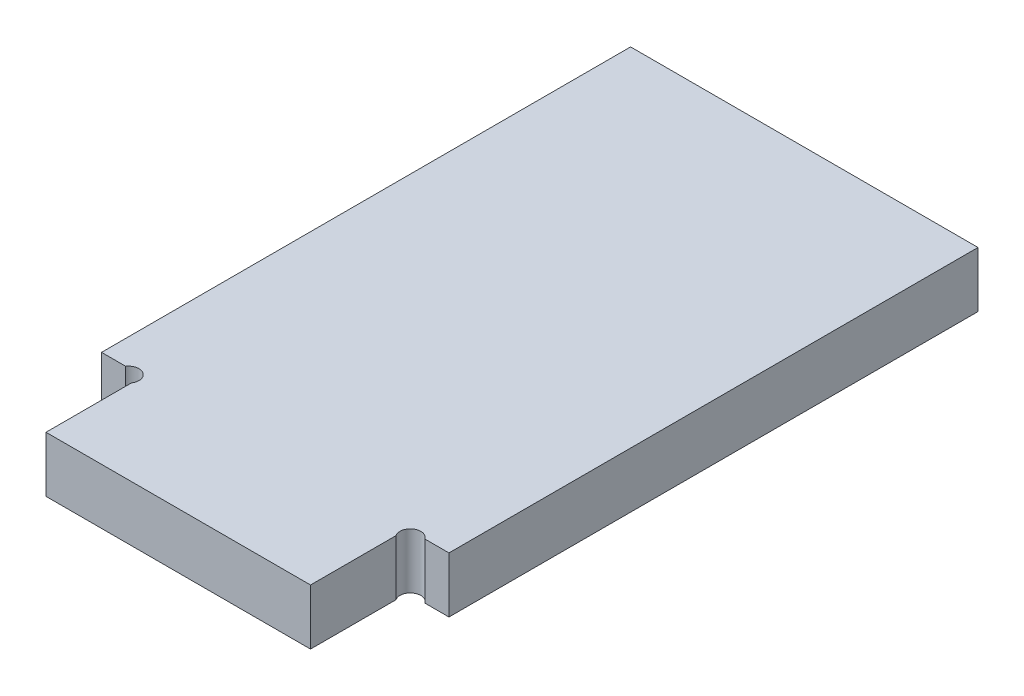
ISO-10303-21;
HEADER;
FILE_DESCRIPTION(('STEP AP214'),'2;1');
FILE_NAME('part.step','',(''),(''),'','','');
FILE_SCHEMA(('AUTOMOTIVE_DESIGN { 1 0 10303 214 1 1 1 1 }'));
ENDSEC;
DATA;
#1=APPLICATION_CONTEXT('core data for automotive mechanical design processes');
#2=APPLICATION_PROTOCOL_DEFINITION('international standard','automotive_design',2000,#1);
#3=PRODUCT_CONTEXT('',#1,'mechanical');
#4=PRODUCT('Part','Part','',(#3));
#5=PRODUCT_RELATED_PRODUCT_CATEGORY('part','',(#4));
#6=PRODUCT_DEFINITION_FORMATION('','',#4);
#7=PRODUCT_DEFINITION_CONTEXT('part definition',#1,'design');
#8=PRODUCT_DEFINITION('design','',#6,#7);
#9=PRODUCT_DEFINITION_SHAPE('','',#8);
#10=(LENGTH_UNIT() NAMED_UNIT(*) SI_UNIT(.MILLI.,.METRE.));
#11=(NAMED_UNIT(*) PLANE_ANGLE_UNIT() SI_UNIT($,.RADIAN.));
#12=(NAMED_UNIT(*) SI_UNIT($,.STERADIAN.) SOLID_ANGLE_UNIT());
#13=UNCERTAINTY_MEASURE_WITH_UNIT(LENGTH_MEASURE(1.E-05),#10,'distance_accuracy_value','');
#14=(GEOMETRIC_REPRESENTATION_CONTEXT(3) GLOBAL_UNCERTAINTY_ASSIGNED_CONTEXT((#13)) GLOBAL_UNIT_ASSIGNED_CONTEXT((#10,
#11,#12)) REPRESENTATION_CONTEXT('',''));
#15=CARTESIAN_POINT('',(0.,0.,0.));
#16=DIRECTION('',(0.,0.,1.));
#17=DIRECTION('',(1.,0.,0.));
#18=AXIS2_PLACEMENT_3D('',#15,#16,#17);
#19=CARTESIAN_POINT('',(-2.0296,0.4,0.083515507542013));
#20=DIRECTION('',(0.,-1.,0.));
#21=DIRECTION('',(0.,0.,-1.));
#22=AXIS2_PLACEMENT_3D('',#19,#20,#21);
#23=CYLINDRICAL_SURFACE('',#22,0.15);
#24=CARTESIAN_POINT('',(-2.0296,-0.4,0.083515507542013));
#25=DIRECTION('',(0.,-1.,0.));
#26=DIRECTION('',(0.,0.,1.));
#27=AXIS2_PLACEMENT_3D('',#24,#25,#26);
#28=CIRCLE('',#27,0.15);
#29=CARTESIAN_POINT('',(-2.1542,-0.4,0.));
#30=VERTEX_POINT('',#29);
#31=CARTESIAN_POINT('',(-1.905,-0.4,0.167031015084026));
#32=VERTEX_POINT('',#31);
#33=EDGE_CURVE('E141',#30,#32,#28,.T.);
#34=ORIENTED_EDGE('',*,*,#33,.T.);
#35=DIRECTION('',(0.,-1.,0.));
#36=VECTOR('',#35,1.);
#37=CARTESIAN_POINT('',(-1.905,0.4,0.167031015084026));
#38=LINE('',#37,#36);
#39=CARTESIAN_POINT('',(-1.905,0.4,0.167031015084026));
#40=VERTEX_POINT('',#39);
#41=EDGE_CURVE('E11',#40,#32,#38,.T.);
#42=ORIENTED_EDGE('',*,*,#41,.F.);
#43=CARTESIAN_POINT('',(-2.0296,0.4,0.083515507542013));
#44=DIRECTION('',(0.,-1.,0.));
#45=DIRECTION('',(0.,0.,1.));
#46=AXIS2_PLACEMENT_3D('',#43,#44,#45);
#47=CIRCLE('',#46,0.15);
#48=CARTESIAN_POINT('',(-2.1542,0.4,0.));
#49=VERTEX_POINT('',#48);
#50=EDGE_CURVE('E159',#49,#40,#47,.T.);
#51=ORIENTED_EDGE('',*,*,#50,.F.);
#52=DIRECTION('',(0.,-1.,0.));
#53=VECTOR('',#52,1.);
#54=CARTESIAN_POINT('',(-2.1542,0.4,0.));
#55=LINE('',#54,#53);
#56=EDGE_CURVE('E137',#49,#30,#55,.T.);
#57=ORIENTED_EDGE('',*,*,#56,.T.);
#58=EDGE_LOOP('',(#34,#42,#51,#57));
#59=FACE_BOUND('',#58,.T.);
#60=ADVANCED_FACE('F33',(#59),#23,.F.);
#61=CARTESIAN_POINT('',(-1.905,0.4,0.167031015084026));
#62=DIRECTION('',(1.,0.,0.));
#63=DIRECTION('',(0.,0.,-1.));
#64=AXIS2_PLACEMENT_3D('',#61,#62,#63);
#65=PLANE('',#64);
#66=DIRECTION('',(0.,0.,1.));
#67=VECTOR('',#66,1.);
#68=CARTESIAN_POINT('',(-1.905,-0.4,0.167031015084026));
#69=LINE('',#68,#67);
#70=CARTESIAN_POINT('',(-1.905,-0.4,1.397));
#71=VERTEX_POINT('',#70);
#72=EDGE_CURVE('E144',#32,#71,#69,.T.);
#73=ORIENTED_EDGE('',*,*,#72,.T.);
#74=DIRECTION('',(0.,-1.,0.));
#75=VECTOR('',#74,1.);
#76=CARTESIAN_POINT('',(-1.905,0.4,1.397));
#77=LINE('',#76,#75);
#78=CARTESIAN_POINT('',(-1.905,0.4,1.397));
#79=VERTEX_POINT('',#78);
#80=EDGE_CURVE('E41',#79,#71,#77,.T.);
#81=ORIENTED_EDGE('',*,*,#80,.F.);
#82=DIRECTION('',(0.,0.,1.));
#83=VECTOR('',#82,1.);
#84=CARTESIAN_POINT('',(-1.905,0.4,0.167031015084026));
#85=LINE('',#84,#83);
#86=EDGE_CURVE('E98',#40,#79,#85,.T.);
#87=ORIENTED_EDGE('',*,*,#86,.F.);
#88=ORIENTED_EDGE('',*,*,#41,.T.);
#89=EDGE_LOOP('',(#73,#81,#87,#88));
#90=FACE_BOUND('',#89,.T.);
#91=ADVANCED_FACE('F208',(#90),#65,.F.);
#92=CARTESIAN_POINT('',(-1.905,0.4,1.397));
#93=DIRECTION('',(0.,0.,-1.));
#94=DIRECTION('',(-1.,0.,0.));
#95=AXIS2_PLACEMENT_3D('',#92,#93,#94);
#96=PLANE('',#95);
#97=DIRECTION('',(1.,0.,0.));
#98=VECTOR('',#97,1.);
#99=CARTESIAN_POINT('',(-1.905,-0.4,1.397));
#100=LINE('',#99,#98);
#101=CARTESIAN_POINT('',(1.905,-0.4,1.397));
#102=VERTEX_POINT('',#101);
#103=EDGE_CURVE('E146',#71,#102,#100,.T.);
#104=ORIENTED_EDGE('',*,*,#103,.T.);
#105=DIRECTION('',(0.,-1.,0.));
#106=VECTOR('',#105,1.);
#107=CARTESIAN_POINT('',(1.905,0.4,1.397));
#108=LINE('',#107,#106);
#109=CARTESIAN_POINT('',(1.905,0.4,1.397));
#110=VERTEX_POINT('',#109);
#111=EDGE_CURVE('E172',#110,#102,#108,.T.);
#112=ORIENTED_EDGE('',*,*,#111,.F.);
#113=DIRECTION('',(1.,0.,0.));
#114=VECTOR('',#113,1.);
#115=CARTESIAN_POINT('',(-1.905,0.4,1.397));
#116=LINE('',#115,#114);
#117=EDGE_CURVE('E180',#79,#110,#116,.T.);
#118=ORIENTED_EDGE('',*,*,#117,.F.);
#119=ORIENTED_EDGE('',*,*,#80,.T.);
#120=EDGE_LOOP('',(#104,#112,#118,#119));
#121=FACE_BOUND('',#120,.T.);
#122=ADVANCED_FACE('F178',(#121),#96,.F.);
#123=CARTESIAN_POINT('',(1.905,0.4,0.167031015084026));
#124=DIRECTION('',(-1.,0.,0.));
#125=DIRECTION('',(0.,0.,1.));
#126=AXIS2_PLACEMENT_3D('',#123,#124,#125);
#127=PLANE('',#126);
#128=DIRECTION('',(0.,0.,-1.));
#129=VECTOR('',#128,1.);
#130=CARTESIAN_POINT('',(1.905,-0.4,0.167031015084026));
#131=LINE('',#130,#129);
#132=CARTESIAN_POINT('',(1.905,-0.4,0.167031015084026));
#133=VERTEX_POINT('',#132);
#134=EDGE_CURVE('E148',#102,#133,#131,.T.);
#135=ORIENTED_EDGE('',*,*,#134,.T.);
#136=DIRECTION('',(0.,-1.,0.));
#137=VECTOR('',#136,1.);
#138=CARTESIAN_POINT('',(1.905,0.4,0.167031015084026));
#139=LINE('',#138,#137);
#140=CARTESIAN_POINT('',(1.905,0.4,0.167031015084026));
#141=VERTEX_POINT('',#140);
#142=EDGE_CURVE('E169',#141,#133,#139,.T.);
#143=ORIENTED_EDGE('',*,*,#142,.F.);
#144=DIRECTION('',(0.,0.,-1.));
#145=VECTOR('',#144,1.);
#146=CARTESIAN_POINT('',(1.905,0.4,0.167031015084026));
#147=LINE('',#146,#145);
#148=EDGE_CURVE('E198',#110,#141,#147,.T.);
#149=ORIENTED_EDGE('',*,*,#148,.F.);
#150=ORIENTED_EDGE('',*,*,#111,.T.);
#151=EDGE_LOOP('',(#135,#143,#149,#150));
#152=FACE_BOUND('',#151,.T.);
#153=ADVANCED_FACE('F189',(#152),#127,.F.);
#154=CARTESIAN_POINT('',(2.0296,0.4,0.0835155075420125));
#155=DIRECTION('',(0.,-1.,0.));
#156=DIRECTION('',(0.,0.,-1.));
#157=AXIS2_PLACEMENT_3D('',#154,#155,#156);
#158=CYLINDRICAL_SURFACE('',#157,0.15);
#159=CARTESIAN_POINT('',(2.0296,-0.4,0.0835155075420125));
#160=DIRECTION('',(0.,-1.,0.));
#161=DIRECTION('',(0.,0.,-1.));
#162=AXIS2_PLACEMENT_3D('',#159,#160,#161);
#163=CIRCLE('',#162,0.15);
#164=CARTESIAN_POINT('',(2.1542,-0.4,0.));
#165=VERTEX_POINT('',#164);
#166=EDGE_CURVE('E150',#133,#165,#163,.T.);
#167=ORIENTED_EDGE('',*,*,#166,.T.);
#168=DIRECTION('',(0.,-1.,0.));
#169=VECTOR('',#168,1.);
#170=CARTESIAN_POINT('',(2.1542,0.4,0.));
#171=LINE('',#170,#169);
#172=CARTESIAN_POINT('',(2.1542,0.4,0.));
#173=VERTEX_POINT('',#172);
#174=EDGE_CURVE('E166',#173,#165,#171,.T.);
#175=ORIENTED_EDGE('',*,*,#174,.F.);
#176=CARTESIAN_POINT('',(2.0296,0.4,0.0835155075420125));
#177=DIRECTION('',(0.,-1.,0.));
#178=DIRECTION('',(0.,0.,-1.));
#179=AXIS2_PLACEMENT_3D('',#176,#177,#178);
#180=CIRCLE('',#179,0.15);
#181=EDGE_CURVE('E195',#141,#173,#180,.T.);
#182=ORIENTED_EDGE('',*,*,#181,.F.);
#183=ORIENTED_EDGE('',*,*,#142,.T.);
#184=EDGE_LOOP('',(#167,#175,#182,#183));
#185=FACE_BOUND('',#184,.T.);
#186=ADVANCED_FACE('F193',(#185),#158,.F.);
#187=CARTESIAN_POINT('',(2.1542,0.4,0.));
#188=DIRECTION('',(0.,0.,-1.));
#189=DIRECTION('',(-1.,0.,0.));
#190=AXIS2_PLACEMENT_3D('',#187,#188,#189);
#191=PLANE('',#190);
#192=DIRECTION('',(1.,0.,0.));
#193=VECTOR('',#192,1.);
#194=CARTESIAN_POINT('',(2.1542,-0.4,0.));
#195=LINE('',#194,#193);
#196=CARTESIAN_POINT('',(2.5019,-0.4,0.));
#197=VERTEX_POINT('',#196);
#198=EDGE_CURVE('E152',#165,#197,#195,.T.);
#199=ORIENTED_EDGE('',*,*,#198,.T.);
#200=DIRECTION('',(0.,-1.,0.));
#201=VECTOR('',#200,1.);
#202=CARTESIAN_POINT('',(2.5019,0.4,0.));
#203=LINE('',#202,#201);
#204=CARTESIAN_POINT('',(2.5019,0.4,0.));
#205=VERTEX_POINT('',#204);
#206=EDGE_CURVE('E163',#205,#197,#203,.T.);
#207=ORIENTED_EDGE('',*,*,#206,.F.);
#208=DIRECTION('',(1.,0.,0.));
#209=VECTOR('',#208,1.);
#210=CARTESIAN_POINT('',(2.1542,0.4,0.));
#211=LINE('',#210,#209);
#212=EDGE_CURVE('E197',#173,#205,#211,.T.);
#213=ORIENTED_EDGE('',*,*,#212,.F.);
#214=ORIENTED_EDGE('',*,*,#174,.T.);
#215=EDGE_LOOP('',(#199,#207,#213,#214));
#216=FACE_BOUND('',#215,.T.);
#217=ADVANCED_FACE('F220',(#216),#191,.F.);
#218=CARTESIAN_POINT('',(2.5019,0.4,0.));
#219=DIRECTION('',(-1.,0.,0.));
#220=DIRECTION('',(0.,0.,1.));
#221=AXIS2_PLACEMENT_3D('',#218,#219,#220);
#222=PLANE('',#221);
#223=DIRECTION('',(0.,0.,-1.));
#224=VECTOR('',#223,1.);
#225=CARTESIAN_POINT('',(2.5019,-0.4,0.));
#226=LINE('',#225,#224);
#227=CARTESIAN_POINT('',(2.5019,-0.4,-7.62));
#228=VERTEX_POINT('',#227);
#229=EDGE_CURVE('E154',#197,#228,#226,.T.);
#230=ORIENTED_EDGE('',*,*,#229,.T.);
#231=DIRECTION('',(0.,-1.,0.));
#232=VECTOR('',#231,1.);
#233=CARTESIAN_POINT('',(2.5019,0.4,-7.62));
#234=LINE('',#233,#232);
#235=CARTESIAN_POINT('',(2.5019,0.4,-7.62));
#236=VERTEX_POINT('',#235);
#237=EDGE_CURVE('E132',#236,#228,#234,.T.);
#238=ORIENTED_EDGE('',*,*,#237,.F.);
#239=DIRECTION('',(0.,0.,-1.));
#240=VECTOR('',#239,1.);
#241=CARTESIAN_POINT('',(2.5019,0.4,0.));
#242=LINE('',#241,#240);
#243=EDGE_CURVE('E123',#205,#236,#242,.T.);
#244=ORIENTED_EDGE('',*,*,#243,.F.);
#245=ORIENTED_EDGE('',*,*,#206,.T.);
#246=EDGE_LOOP('',(#230,#238,#244,#245));
#247=FACE_BOUND('',#246,.T.);
#248=ADVANCED_FACE('F223',(#247),#222,.F.);
#249=CARTESIAN_POINT('',(-2.5019,0.4,-7.62));
#250=DIRECTION('',(0.,0.,1.));
#251=DIRECTION('',(1.,0.,0.));
#252=AXIS2_PLACEMENT_3D('',#249,#250,#251);
#253=PLANE('',#252);
#254=DIRECTION('',(-1.,0.,0.));
#255=VECTOR('',#254,1.);
#256=CARTESIAN_POINT('',(-2.5019,-0.4,-7.62));
#257=LINE('',#256,#255);
#258=CARTESIAN_POINT('',(-2.5019,-0.4,-7.62));
#259=VERTEX_POINT('',#258);
#260=EDGE_CURVE('E131',#228,#259,#257,.T.);
#261=ORIENTED_EDGE('',*,*,#260,.T.);
#262=DIRECTION('',(0.,-1.,0.));
#263=VECTOR('',#262,1.);
#264=CARTESIAN_POINT('',(-2.5019,0.4,-7.62));
#265=LINE('',#264,#263);
#266=CARTESIAN_POINT('',(-2.5019,0.4,-7.62));
#267=VERTEX_POINT('',#266);
#268=EDGE_CURVE('E128',#267,#259,#265,.T.);
#269=ORIENTED_EDGE('',*,*,#268,.F.);
#270=DIRECTION('',(-1.,0.,0.));
#271=VECTOR('',#270,1.);
#272=CARTESIAN_POINT('',(-2.5019,0.4,-7.62));
#273=LINE('',#272,#271);
#274=EDGE_CURVE('E117',#236,#267,#273,.T.);
#275=ORIENTED_EDGE('',*,*,#274,.F.);
#276=ORIENTED_EDGE('',*,*,#237,.T.);
#277=EDGE_LOOP('',(#261,#269,#275,#276));
#278=FACE_BOUND('',#277,.T.);
#279=ADVANCED_FACE('F129',(#278),#253,.F.);
#280=CARTESIAN_POINT('',(-2.5019,0.4,0.));
#281=DIRECTION('',(1.,0.,0.));
#282=DIRECTION('',(0.,0.,-1.));
#283=AXIS2_PLACEMENT_3D('',#280,#281,#282);
#284=PLANE('',#283);
#285=DIRECTION('',(0.,0.,1.));
#286=VECTOR('',#285,1.);
#287=CARTESIAN_POINT('',(-2.5019,-0.4,0.));
#288=LINE('',#287,#286);
#289=CARTESIAN_POINT('',(-2.5019,-0.4,0.));
#290=VERTEX_POINT('',#289);
#291=EDGE_CURVE('E84',#259,#290,#288,.T.);
#292=ORIENTED_EDGE('',*,*,#291,.T.);
#293=DIRECTION('',(0.,-1.,0.));
#294=VECTOR('',#293,1.);
#295=CARTESIAN_POINT('',(-2.5019,0.4,0.));
#296=LINE('',#295,#294);
#297=CARTESIAN_POINT('',(-2.5019,0.4,0.));
#298=VERTEX_POINT('',#297);
#299=EDGE_CURVE('E133',#298,#290,#296,.T.);
#300=ORIENTED_EDGE('',*,*,#299,.F.);
#301=DIRECTION('',(0.,0.,1.));
#302=VECTOR('',#301,1.);
#303=CARTESIAN_POINT('',(-2.5019,0.4,0.));
#304=LINE('',#303,#302);
#305=EDGE_CURVE('E121',#267,#298,#304,.T.);
#306=ORIENTED_EDGE('',*,*,#305,.F.);
#307=ORIENTED_EDGE('',*,*,#268,.T.);
#308=EDGE_LOOP('',(#292,#300,#306,#307));
#309=FACE_BOUND('',#308,.T.);
#310=ADVANCED_FACE('F135',(#309),#284,.F.);
#311=CARTESIAN_POINT('',(-2.1542,0.4,0.));
#312=DIRECTION('',(0.,0.,-1.));
#313=DIRECTION('',(-1.,0.,0.));
#314=AXIS2_PLACEMENT_3D('',#311,#312,#313);
#315=PLANE('',#314);
#316=DIRECTION('',(1.,0.,0.));
#317=VECTOR('',#316,1.);
#318=CARTESIAN_POINT('',(-2.1542,-0.4,0.));
#319=LINE('',#318,#317);
#320=EDGE_CURVE('E90',#290,#30,#319,.T.);
#321=ORIENTED_EDGE('',*,*,#320,.T.);
#322=ORIENTED_EDGE('',*,*,#56,.F.);
#323=DIRECTION('',(1.,0.,0.));
#324=VECTOR('',#323,1.);
#325=CARTESIAN_POINT('',(-2.1542,0.4,0.));
#326=LINE('',#325,#324);
#327=EDGE_CURVE('E49',#298,#49,#326,.T.);
#328=ORIENTED_EDGE('',*,*,#327,.F.);
#329=ORIENTED_EDGE('',*,*,#299,.T.);
#330=EDGE_LOOP('',(#321,#322,#328,#329));
#331=FACE_BOUND('',#330,.T.);
#332=ADVANCED_FACE('F232',(#331),#315,.F.);
#333=CARTESIAN_POINT('',(-2.0296,0.4,0.083515507542013));
#334=DIRECTION('',(0.,1.,0.));
#335=DIRECTION('',(0.,0.,1.));
#336=AXIS2_PLACEMENT_3D('',#333,#334,#335);
#337=PLANE('',#336);
#338=ORIENTED_EDGE('',*,*,#50,.T.);
#339=ORIENTED_EDGE('',*,*,#86,.T.);
#340=ORIENTED_EDGE('',*,*,#117,.T.);
#341=ORIENTED_EDGE('',*,*,#148,.T.);
#342=ORIENTED_EDGE('',*,*,#181,.T.);
#343=ORIENTED_EDGE('',*,*,#212,.T.);
#344=ORIENTED_EDGE('',*,*,#243,.T.);
#345=ORIENTED_EDGE('',*,*,#274,.T.);
#346=ORIENTED_EDGE('',*,*,#305,.T.);
#347=ORIENTED_EDGE('',*,*,#327,.T.);
#348=EDGE_LOOP('',(#338,#339,#340,#341,#342,#343,#344,#345,#346,#347));
#349=FACE_BOUND('',#348,.T.);
#350=ADVANCED_FACE('F119',(#349),#337,.T.);
#351=CARTESIAN_POINT('',(-2.0296,-0.4,0.083515507542013));
#352=DIRECTION('',(0.,1.,0.));
#353=DIRECTION('',(0.,0.,1.));
#354=AXIS2_PLACEMENT_3D('',#351,#352,#353);
#355=PLANE('',#354);
#356=ORIENTED_EDGE('',*,*,#33,.F.);
#357=ORIENTED_EDGE('',*,*,#320,.F.);
#358=ORIENTED_EDGE('',*,*,#291,.F.);
#359=ORIENTED_EDGE('',*,*,#260,.F.);
#360=ORIENTED_EDGE('',*,*,#229,.F.);
#361=ORIENTED_EDGE('',*,*,#198,.F.);
#362=ORIENTED_EDGE('',*,*,#166,.F.);
#363=ORIENTED_EDGE('',*,*,#134,.F.);
#364=ORIENTED_EDGE('',*,*,#103,.F.);
#365=ORIENTED_EDGE('',*,*,#72,.F.);
#366=EDGE_LOOP('',(#356,#357,#358,#359,#360,#361,#362,#363,#364,#365));
#367=FACE_BOUND('',#366,.T.);
#368=ADVANCED_FACE('F184',(#367),#355,.F.);
#369=CLOSED_SHELL('',(#60,#91,#122,#153,#186,#217,#248,#279,#310,#332,#350,#368));
#370=MANIFOLD_SOLID_BREP('B2',#369);
#371=ADVANCED_BREP_SHAPE_REPRESENTATION('',(#18,#370),#14);
#372=SHAPE_DEFINITION_REPRESENTATION(#9,#371);
ENDSEC;
END-ISO-10303-21;
